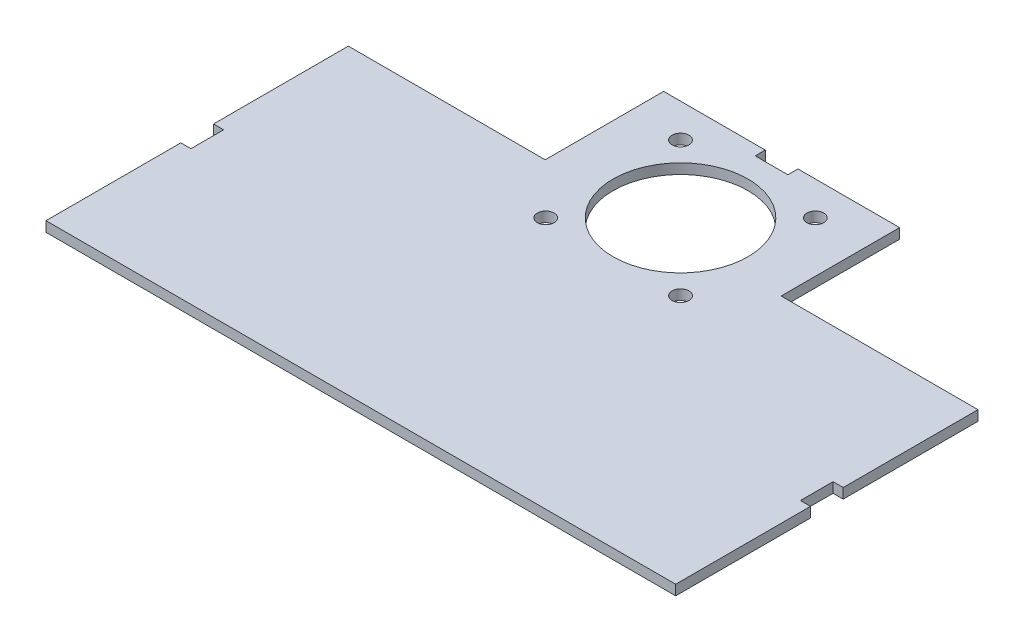
ISO-10303-21;
HEADER;
FILE_DESCRIPTION(('STEP AP214'),'2;1');
FILE_NAME('part.step','',(''),(''),'','','');
FILE_SCHEMA(('AUTOMOTIVE_DESIGN { 1 0 10303 214 1 1 1 1 }'));
ENDSEC;
DATA;
#1=APPLICATION_CONTEXT('core data for automotive mechanical design processes');
#2=APPLICATION_PROTOCOL_DEFINITION('international standard','automotive_design',2000,#1);
#3=PRODUCT_CONTEXT('',#1,'mechanical');
#4=PRODUCT('Part','Part','',(#3));
#5=PRODUCT_RELATED_PRODUCT_CATEGORY('part','',(#4));
#6=PRODUCT_DEFINITION_FORMATION('','',#4);
#7=PRODUCT_DEFINITION_CONTEXT('part definition',#1,'design');
#8=PRODUCT_DEFINITION('design','',#6,#7);
#9=PRODUCT_DEFINITION_SHAPE('','',#8);
#10=(LENGTH_UNIT() NAMED_UNIT(*) SI_UNIT(.MILLI.,.METRE.));
#11=(NAMED_UNIT(*) PLANE_ANGLE_UNIT() SI_UNIT($,.RADIAN.));
#12=(NAMED_UNIT(*) SI_UNIT($,.STERADIAN.) SOLID_ANGLE_UNIT());
#13=UNCERTAINTY_MEASURE_WITH_UNIT(LENGTH_MEASURE(1.E-05),#10,'distance_accuracy_value','');
#14=(GEOMETRIC_REPRESENTATION_CONTEXT(3) GLOBAL_UNCERTAINTY_ASSIGNED_CONTEXT((#13)) GLOBAL_UNIT_ASSIGNED_CONTEXT((#10,
#11,#12)) REPRESENTATION_CONTEXT('',''));
#15=CARTESIAN_POINT('',(0.,0.,0.));
#16=DIRECTION('',(0.,0.,1.));
#17=DIRECTION('',(1.,0.,0.));
#18=AXIS2_PLACEMENT_3D('',#15,#16,#17);
#19=CARTESIAN_POINT('',(-148.288384343825,3.,101.609139144492));
#20=DIRECTION('',(0.,0.,-1.));
#21=DIRECTION('',(-1.,0.,0.));
#22=AXIS2_PLACEMENT_3D('',#19,#20,#21);
#23=PLANE('',#22);
#24=DIRECTION('',(1.,0.,0.));
#25=VECTOR('',#24,1.);
#26=CARTESIAN_POINT('',(-148.288384343825,0.,101.609139144492));
#27=LINE('',#26,#25);
#28=CARTESIAN_POINT('',(-151.288384343825,0.,101.609139144492));
#29=VERTEX_POINT('',#28);
#30=CARTESIAN_POINT('',(-148.288384343825,0.,101.609139144492));
#31=VERTEX_POINT('',#30);
#32=EDGE_CURVE('E206',#29,#31,#27,.T.);
#33=ORIENTED_EDGE('',*,*,#32,.T.);
#34=DIRECTION('',(0.,-1.,0.));
#35=VECTOR('',#34,1.);
#36=CARTESIAN_POINT('',(-148.288384343825,3.,101.609139144492));
#37=LINE('',#36,#35);
#38=CARTESIAN_POINT('',(-148.288384343825,3.,101.609139144492));
#39=VERTEX_POINT('',#38);
#40=EDGE_CURVE('E11',#39,#31,#37,.T.);
#41=ORIENTED_EDGE('',*,*,#40,.F.);
#42=DIRECTION('',(1.,0.,0.));
#43=VECTOR('',#42,1.);
#44=CARTESIAN_POINT('',(-148.288384343825,3.,101.609139144492));
#45=LINE('',#44,#43);
#46=CARTESIAN_POINT('',(-151.288384343825,3.,101.609139144492));
#47=VERTEX_POINT('',#46);
#48=EDGE_CURVE('E244',#47,#39,#45,.T.);
#49=ORIENTED_EDGE('',*,*,#48,.F.);
#50=DIRECTION('',(0.,-1.,0.));
#51=VECTOR('',#50,1.);
#52=CARTESIAN_POINT('',(-151.288384343825,3.,101.609139144492));
#53=LINE('',#52,#51);
#54=EDGE_CURVE('E202',#47,#29,#53,.T.);
#55=ORIENTED_EDGE('',*,*,#54,.T.);
#56=EDGE_LOOP('',(#33,#41,#49,#55));
#57=FACE_BOUND('',#56,.T.);
#58=ADVANCED_FACE('F36',(#57),#23,.F.);
#59=CARTESIAN_POINT('',(-148.288384343825,3.,111.309139144492));
#60=DIRECTION('',(1.,0.,0.));
#61=DIRECTION('',(0.,0.,-1.));
#62=AXIS2_PLACEMENT_3D('',#59,#60,#61);
#63=PLANE('',#62);
#64=DIRECTION('',(0.,0.,1.));
#65=VECTOR('',#64,1.);
#66=CARTESIAN_POINT('',(-148.288384343825,0.,111.309139144492));
#67=LINE('',#66,#65);
#68=CARTESIAN_POINT('',(-148.288384343825,0.,111.309139144492));
#69=VERTEX_POINT('',#68);
#70=EDGE_CURVE('E209',#31,#69,#67,.T.);
#71=ORIENTED_EDGE('',*,*,#70,.T.);
#72=DIRECTION('',(0.,-1.,0.));
#73=VECTOR('',#72,1.);
#74=CARTESIAN_POINT('',(-148.288384343825,3.,111.309139144492));
#75=LINE('',#74,#73);
#76=CARTESIAN_POINT('',(-148.288384343825,3.,111.309139144492));
#77=VERTEX_POINT('',#76);
#78=EDGE_CURVE('E45',#77,#69,#75,.T.);
#79=ORIENTED_EDGE('',*,*,#78,.F.);
#80=DIRECTION('',(0.,0.,1.));
#81=VECTOR('',#80,1.);
#82=CARTESIAN_POINT('',(-148.288384343825,3.,111.309139144492));
#83=LINE('',#82,#81);
#84=EDGE_CURVE('E133',#39,#77,#83,.T.);
#85=ORIENTED_EDGE('',*,*,#84,.F.);
#86=ORIENTED_EDGE('',*,*,#40,.T.);
#87=EDGE_LOOP('',(#71,#79,#85,#86));
#88=FACE_BOUND('',#87,.T.);
#89=ADVANCED_FACE('F340',(#88),#63,.F.);
#90=CARTESIAN_POINT('',(-148.288384343825,3.,111.309139144492));
#91=DIRECTION('',(0.,0.,1.));
#92=DIRECTION('',(1.,0.,0.));
#93=AXIS2_PLACEMENT_3D('',#90,#91,#92);
#94=PLANE('',#93);
#95=DIRECTION('',(-1.,0.,0.));
#96=VECTOR('',#95,1.);
#97=CARTESIAN_POINT('',(-148.288384343825,0.,111.309139144492));
#98=LINE('',#97,#96);
#99=CARTESIAN_POINT('',(-151.288384343825,0.,111.309139144492));
#100=VERTEX_POINT('',#99);
#101=EDGE_CURVE('E211',#69,#100,#98,.T.);
#102=ORIENTED_EDGE('',*,*,#101,.T.);
#103=DIRECTION('',(0.,-1.,0.));
#104=VECTOR('',#103,1.);
#105=CARTESIAN_POINT('',(-151.288384343825,3.,111.309139144492));
#106=LINE('',#105,#104);
#107=CARTESIAN_POINT('',(-151.288384343825,3.,111.309139144492));
#108=VERTEX_POINT('',#107);
#109=EDGE_CURVE('E287',#108,#100,#106,.T.);
#110=ORIENTED_EDGE('',*,*,#109,.F.);
#111=DIRECTION('',(-1.,0.,0.));
#112=VECTOR('',#111,1.);
#113=CARTESIAN_POINT('',(-148.288384343825,3.,111.309139144492));
#114=LINE('',#113,#112);
#115=EDGE_CURVE('E495',#77,#108,#114,.T.);
#116=ORIENTED_EDGE('',*,*,#115,.F.);
#117=ORIENTED_EDGE('',*,*,#78,.T.);
#118=EDGE_LOOP('',(#102,#110,#116,#117));
#119=FACE_BOUND('',#118,.T.);
#120=ADVANCED_FACE('F344',(#119),#94,.F.);
#121=CARTESIAN_POINT('',(-151.288384343825,3.,111.309139144492));
#122=DIRECTION('',(1.,0.,0.));
#123=DIRECTION('',(0.,0.,-1.));
#124=AXIS2_PLACEMENT_3D('',#121,#122,#123);
#125=PLANE('',#124);
#126=DIRECTION('',(0.,0.,1.));
#127=VECTOR('',#126,1.);
#128=CARTESIAN_POINT('',(-151.288384343825,0.,111.309139144492));
#129=LINE('',#128,#127);
#130=CARTESIAN_POINT('',(-151.288384343825,0.,151.309139144492));
#131=VERTEX_POINT('',#130);
#132=EDGE_CURVE('E213',#100,#131,#129,.T.);
#133=ORIENTED_EDGE('',*,*,#132,.T.);
#134=DIRECTION('',(0.,-1.,0.));
#135=VECTOR('',#134,1.);
#136=CARTESIAN_POINT('',(-151.288384343825,3.,151.309139144492));
#137=LINE('',#136,#135);
#138=CARTESIAN_POINT('',(-151.288384343825,3.,151.309139144492));
#139=VERTEX_POINT('',#138);
#140=EDGE_CURVE('E284',#139,#131,#137,.T.);
#141=ORIENTED_EDGE('',*,*,#140,.F.);
#142=DIRECTION('',(0.,0.,1.));
#143=VECTOR('',#142,1.);
#144=CARTESIAN_POINT('',(-151.288384343825,3.,111.309139144492));
#145=LINE('',#144,#143);
#146=EDGE_CURVE('E497',#108,#139,#145,.T.);
#147=ORIENTED_EDGE('',*,*,#146,.F.);
#148=ORIENTED_EDGE('',*,*,#109,.T.);
#149=EDGE_LOOP('',(#133,#141,#147,#148));
#150=FACE_BOUND('',#149,.T.);
#151=ADVANCED_FACE('F348',(#150),#125,.F.);
#152=CARTESIAN_POINT('',(-151.288384343825,3.,151.309139144492));
#153=DIRECTION('',(0.,0.,-1.));
#154=DIRECTION('',(-1.,0.,0.));
#155=AXIS2_PLACEMENT_3D('',#152,#153,#154);
#156=PLANE('',#155);
#157=DIRECTION('',(1.,0.,0.));
#158=VECTOR('',#157,1.);
#159=CARTESIAN_POINT('',(-151.288384343825,0.,151.309139144492));
#160=LINE('',#159,#158);
#161=CARTESIAN_POINT('',(35.5316156561952,0.,151.309139144492));
#162=VERTEX_POINT('',#161);
#163=EDGE_CURVE('E215',#131,#162,#160,.T.);
#164=ORIENTED_EDGE('',*,*,#163,.T.);
#165=DIRECTION('',(0.,-1.,0.));
#166=VECTOR('',#165,1.);
#167=CARTESIAN_POINT('',(35.5316156561952,3.,151.309139144492));
#168=LINE('',#167,#166);
#169=CARTESIAN_POINT('',(35.5316156561952,3.,151.309139144492));
#170=VERTEX_POINT('',#169);
#171=EDGE_CURVE('E281',#170,#162,#168,.T.);
#172=ORIENTED_EDGE('',*,*,#171,.F.);
#173=DIRECTION('',(1.,0.,0.));
#174=VECTOR('',#173,1.);
#175=CARTESIAN_POINT('',(-151.288384343825,3.,151.309139144492));
#176=LINE('',#175,#174);
#177=EDGE_CURVE('E499',#139,#170,#176,.T.);
#178=ORIENTED_EDGE('',*,*,#177,.F.);
#179=ORIENTED_EDGE('',*,*,#140,.T.);
#180=EDGE_LOOP('',(#164,#172,#178,#179));
#181=FACE_BOUND('',#180,.T.);
#182=ADVANCED_FACE('F354',(#181),#156,.F.);
#183=CARTESIAN_POINT('',(35.5316156561952,3.,151.309139144492));
#184=DIRECTION('',(-1.,0.,0.));
#185=DIRECTION('',(0.,0.,1.));
#186=AXIS2_PLACEMENT_3D('',#183,#184,#185);
#187=PLANE('',#186);
#188=DIRECTION('',(0.,0.,-1.));
#189=VECTOR('',#188,1.);
#190=CARTESIAN_POINT('',(35.5316156561952,0.,151.309139144492));
#191=LINE('',#190,#189);
#192=CARTESIAN_POINT('',(35.5316156561952,0.,111.309139144492));
#193=VERTEX_POINT('',#192);
#194=EDGE_CURVE('E217',#162,#193,#191,.T.);
#195=ORIENTED_EDGE('',*,*,#194,.T.);
#196=DIRECTION('',(0.,-1.,0.));
#197=VECTOR('',#196,1.);
#198=CARTESIAN_POINT('',(35.5316156561952,3.,111.309139144492));
#199=LINE('',#198,#197);
#200=CARTESIAN_POINT('',(35.5316156561952,3.,111.309139144492));
#201=VERTEX_POINT('',#200);
#202=EDGE_CURVE('E278',#201,#193,#199,.T.);
#203=ORIENTED_EDGE('',*,*,#202,.F.);
#204=DIRECTION('',(0.,0.,-1.));
#205=VECTOR('',#204,1.);
#206=CARTESIAN_POINT('',(35.5316156561952,3.,151.309139144492));
#207=LINE('',#206,#205);
#208=EDGE_CURVE('E501',#170,#201,#207,.T.);
#209=ORIENTED_EDGE('',*,*,#208,.F.);
#210=ORIENTED_EDGE('',*,*,#171,.T.);
#211=EDGE_LOOP('',(#195,#203,#209,#210));
#212=FACE_BOUND('',#211,.T.);
#213=ADVANCED_FACE('F358',(#212),#187,.F.);
#214=CARTESIAN_POINT('',(35.5316156561952,3.,111.309139144492));
#215=DIRECTION('',(0.,0.,1.));
#216=DIRECTION('',(1.,0.,0.));
#217=AXIS2_PLACEMENT_3D('',#214,#215,#216);
#218=PLANE('',#217);
#219=DIRECTION('',(-1.,0.,0.));
#220=VECTOR('',#219,1.);
#221=CARTESIAN_POINT('',(35.5316156561952,0.,111.309139144492));
#222=LINE('',#221,#220);
#223=CARTESIAN_POINT('',(32.5316156561952,0.,111.309139144492));
#224=VERTEX_POINT('',#223);
#225=EDGE_CURVE('E219',#193,#224,#222,.T.);
#226=ORIENTED_EDGE('',*,*,#225,.T.);
#227=DIRECTION('',(0.,-1.,0.));
#228=VECTOR('',#227,1.);
#229=CARTESIAN_POINT('',(32.5316156561952,3.,111.309139144492));
#230=LINE('',#229,#228);
#231=CARTESIAN_POINT('',(32.5316156561952,3.,111.309139144492));
#232=VERTEX_POINT('',#231);
#233=EDGE_CURVE('E275',#232,#224,#230,.T.);
#234=ORIENTED_EDGE('',*,*,#233,.F.);
#235=DIRECTION('',(-1.,0.,0.));
#236=VECTOR('',#235,1.);
#237=CARTESIAN_POINT('',(35.5316156561952,3.,111.309139144492));
#238=LINE('',#237,#236);
#239=EDGE_CURVE('E503',#201,#232,#238,.T.);
#240=ORIENTED_EDGE('',*,*,#239,.F.);
#241=ORIENTED_EDGE('',*,*,#202,.T.);
#242=EDGE_LOOP('',(#226,#234,#240,#241));
#243=FACE_BOUND('',#242,.T.);
#244=ADVANCED_FACE('F362',(#243),#218,.F.);
#245=CARTESIAN_POINT('',(32.5316156561953,3.,101.609139144492));
#246=DIRECTION('',(-1.,0.,0.));
#247=DIRECTION('',(0.,0.,1.));
#248=AXIS2_PLACEMENT_3D('',#245,#246,#247);
#249=PLANE('',#248);
#250=DIRECTION('',(0.,0.,-1.));
#251=VECTOR('',#250,1.);
#252=CARTESIAN_POINT('',(32.5316156561953,0.,101.609139144492));
#253=LINE('',#252,#251);
#254=CARTESIAN_POINT('',(32.5316156561953,0.,101.609139144492));
#255=VERTEX_POINT('',#254);
#256=EDGE_CURVE('E221',#224,#255,#253,.T.);
#257=ORIENTED_EDGE('',*,*,#256,.T.);
#258=DIRECTION('',(0.,-1.,0.));
#259=VECTOR('',#258,1.);
#260=CARTESIAN_POINT('',(32.5316156561953,3.,101.609139144492));
#261=LINE('',#260,#259);
#262=CARTESIAN_POINT('',(32.5316156561953,3.,101.609139144492));
#263=VERTEX_POINT('',#262);
#264=EDGE_CURVE('E272',#263,#255,#261,.T.);
#265=ORIENTED_EDGE('',*,*,#264,.F.);
#266=DIRECTION('',(0.,0.,-1.));
#267=VECTOR('',#266,1.);
#268=CARTESIAN_POINT('',(32.5316156561953,3.,101.609139144492));
#269=LINE('',#268,#267);
#270=EDGE_CURVE('E505',#232,#263,#269,.T.);
#271=ORIENTED_EDGE('',*,*,#270,.F.);
#272=ORIENTED_EDGE('',*,*,#233,.T.);
#273=EDGE_LOOP('',(#257,#265,#271,#272));
#274=FACE_BOUND('',#273,.T.);
#275=ADVANCED_FACE('F366',(#274),#249,.F.);
#276=CARTESIAN_POINT('',(35.5316156561953,3.,101.609139144492));
#277=DIRECTION('',(0.,0.,-1.));
#278=DIRECTION('',(-1.,0.,0.));
#279=AXIS2_PLACEMENT_3D('',#276,#277,#278);
#280=PLANE('',#279);
#281=DIRECTION('',(1.,0.,0.));
#282=VECTOR('',#281,1.);
#283=CARTESIAN_POINT('',(35.5316156561953,0.,101.609139144492));
#284=LINE('',#283,#282);
#285=CARTESIAN_POINT('',(35.5316156561953,0.,101.609139144492));
#286=VERTEX_POINT('',#285);
#287=EDGE_CURVE('E223',#255,#286,#284,.T.);
#288=ORIENTED_EDGE('',*,*,#287,.T.);
#289=DIRECTION('',(0.,-1.,0.));
#290=VECTOR('',#289,1.);
#291=CARTESIAN_POINT('',(35.5316156561953,3.,101.609139144492));
#292=LINE('',#291,#290);
#293=CARTESIAN_POINT('',(35.5316156561953,3.,101.609139144492));
#294=VERTEX_POINT('',#293);
#295=EDGE_CURVE('E269',#294,#286,#292,.T.);
#296=ORIENTED_EDGE('',*,*,#295,.F.);
#297=DIRECTION('',(1.,0.,0.));
#298=VECTOR('',#297,1.);
#299=CARTESIAN_POINT('',(35.5316156561953,3.,101.609139144492));
#300=LINE('',#299,#298);
#301=EDGE_CURVE('E507',#263,#294,#300,.T.);
#302=ORIENTED_EDGE('',*,*,#301,.F.);
#303=ORIENTED_EDGE('',*,*,#264,.T.);
#304=EDGE_LOOP('',(#288,#296,#302,#303));
#305=FACE_BOUND('',#304,.T.);
#306=ADVANCED_FACE('F370',(#305),#280,.F.);
#307=CARTESIAN_POINT('',(35.5316156561953,3.,61.609139144492));
#308=DIRECTION('',(-1.,0.,0.));
#309=DIRECTION('',(0.,0.,1.));
#310=AXIS2_PLACEMENT_3D('',#307,#308,#309);
#311=PLANE('',#310);
#312=DIRECTION('',(0.,0.,-1.));
#313=VECTOR('',#312,1.);
#314=CARTESIAN_POINT('',(35.5316156561953,0.,61.609139144492));
#315=LINE('',#314,#313);
#316=CARTESIAN_POINT('',(35.5316156561953,0.,61.609139144492));
#317=VERTEX_POINT('',#316);
#318=EDGE_CURVE('E225',#286,#317,#315,.T.);
#319=ORIENTED_EDGE('',*,*,#318,.T.);
#320=DIRECTION('',(0.,-1.,0.));
#321=VECTOR('',#320,1.);
#322=CARTESIAN_POINT('',(35.5316156561953,3.,61.609139144492));
#323=LINE('',#322,#321);
#324=CARTESIAN_POINT('',(35.5316156561953,3.,61.609139144492));
#325=VERTEX_POINT('',#324);
#326=EDGE_CURVE('E266',#325,#317,#323,.T.);
#327=ORIENTED_EDGE('',*,*,#326,.F.);
#328=DIRECTION('',(0.,0.,-1.));
#329=VECTOR('',#328,1.);
#330=CARTESIAN_POINT('',(35.5316156561953,3.,61.609139144492));
#331=LINE('',#330,#329);
#332=EDGE_CURVE('E509',#294,#325,#331,.T.);
#333=ORIENTED_EDGE('',*,*,#332,.F.);
#334=ORIENTED_EDGE('',*,*,#295,.T.);
#335=EDGE_LOOP('',(#319,#327,#333,#334));
#336=FACE_BOUND('',#335,.T.);
#337=ADVANCED_FACE('F374',(#336),#311,.F.);
#338=CARTESIAN_POINT('',(-22.878384343815,3.,61.609139144492));
#339=DIRECTION('',(0.,0.,1.));
#340=DIRECTION('',(1.,0.,0.));
#341=AXIS2_PLACEMENT_3D('',#338,#339,#340);
#342=PLANE('',#341);
#343=DIRECTION('',(-1.,0.,0.));
#344=VECTOR('',#343,1.);
#345=CARTESIAN_POINT('',(-22.878384343815,0.,61.609139144492));
#346=LINE('',#345,#344);
#347=CARTESIAN_POINT('',(-22.878384343815,0.,61.609139144492));
#348=VERTEX_POINT('',#347);
#349=EDGE_CURVE('E227',#317,#348,#346,.T.);
#350=ORIENTED_EDGE('',*,*,#349,.T.);
#351=DIRECTION('',(0.,-1.,0.));
#352=VECTOR('',#351,1.);
#353=CARTESIAN_POINT('',(-22.878384343815,3.,61.609139144492));
#354=LINE('',#353,#352);
#355=CARTESIAN_POINT('',(-22.878384343815,3.,61.609139144492));
#356=VERTEX_POINT('',#355);
#357=EDGE_CURVE('E263',#356,#348,#354,.T.);
#358=ORIENTED_EDGE('',*,*,#357,.F.);
#359=DIRECTION('',(-1.,0.,0.));
#360=VECTOR('',#359,1.);
#361=CARTESIAN_POINT('',(-22.878384343815,3.,61.609139144492));
#362=LINE('',#361,#360);
#363=EDGE_CURVE('E511',#325,#356,#362,.T.);
#364=ORIENTED_EDGE('',*,*,#363,.F.);
#365=ORIENTED_EDGE('',*,*,#326,.T.);
#366=EDGE_LOOP('',(#350,#358,#364,#365));
#367=FACE_BOUND('',#366,.T.);
#368=ADVANCED_FACE('F378',(#367),#342,.F.);
#369=CARTESIAN_POINT('',(-22.878384343815,3.,26.459139144492));
#370=DIRECTION('',(-1.,0.,0.));
#371=DIRECTION('',(0.,0.,1.));
#372=AXIS2_PLACEMENT_3D('',#369,#370,#371);
#373=PLANE('',#372);
#374=DIRECTION('',(0.,0.,-1.));
#375=VECTOR('',#374,1.);
#376=CARTESIAN_POINT('',(-22.878384343815,0.,26.459139144492));
#377=LINE('',#376,#375);
#378=CARTESIAN_POINT('',(-22.878384343815,0.,26.459139144492));
#379=VERTEX_POINT('',#378);
#380=EDGE_CURVE('E229',#348,#379,#377,.T.);
#381=ORIENTED_EDGE('',*,*,#380,.T.);
#382=DIRECTION('',(0.,-1.,0.));
#383=VECTOR('',#382,1.);
#384=CARTESIAN_POINT('',(-22.878384343815,3.,26.459139144492));
#385=LINE('',#384,#383);
#386=CARTESIAN_POINT('',(-22.878384343815,3.,26.459139144492));
#387=VERTEX_POINT('',#386);
#388=EDGE_CURVE('E260',#387,#379,#385,.T.);
#389=ORIENTED_EDGE('',*,*,#388,.F.);
#390=DIRECTION('',(0.,0.,-1.));
#391=VECTOR('',#390,1.);
#392=CARTESIAN_POINT('',(-22.878384343815,3.,26.459139144492));
#393=LINE('',#392,#391);
#394=EDGE_CURVE('E513',#356,#387,#393,.T.);
#395=ORIENTED_EDGE('',*,*,#394,.F.);
#396=ORIENTED_EDGE('',*,*,#357,.T.);
#397=EDGE_LOOP('',(#381,#389,#395,#396));
#398=FACE_BOUND('',#397,.T.);
#399=ADVANCED_FACE('F382',(#398),#373,.F.);
#400=CARTESIAN_POINT('',(-22.878384343815,3.,26.459139144492));
#401=DIRECTION('',(0.,0.,1.));
#402=DIRECTION('',(1.,0.,0.));
#403=AXIS2_PLACEMENT_3D('',#400,#401,#402);
#404=PLANE('',#403);
#405=DIRECTION('',(-1.,0.,0.));
#406=VECTOR('',#405,1.);
#407=CARTESIAN_POINT('',(-22.878384343815,0.,26.459139144492));
#408=LINE('',#407,#406);
#409=CARTESIAN_POINT('',(-53.028384343815,0.,26.4591391444919));
#410=VERTEX_POINT('',#409);
#411=EDGE_CURVE('E231',#379,#410,#408,.T.);
#412=ORIENTED_EDGE('',*,*,#411,.T.);
#413=DIRECTION('',(0.,-1.,0.));
#414=VECTOR('',#413,1.);
#415=CARTESIAN_POINT('',(-53.028384343815,3.,26.4591391444919));
#416=LINE('',#415,#414);
#417=CARTESIAN_POINT('',(-53.028384343815,3.,26.4591391444919));
#418=VERTEX_POINT('',#417);
#419=EDGE_CURVE('E257',#418,#410,#416,.T.);
#420=ORIENTED_EDGE('',*,*,#419,.F.);
#421=DIRECTION('',(-1.,0.,0.));
#422=VECTOR('',#421,1.);
#423=CARTESIAN_POINT('',(-22.878384343815,3.,26.459139144492));
#424=LINE('',#423,#422);
#425=EDGE_CURVE('E515',#387,#418,#424,.T.);
#426=ORIENTED_EDGE('',*,*,#425,.F.);
#427=ORIENTED_EDGE('',*,*,#388,.T.);
#428=EDGE_LOOP('',(#412,#420,#426,#427));
#429=FACE_BOUND('',#428,.T.);
#430=ADVANCED_FACE('F386',(#429),#404,.F.);
#431=CARTESIAN_POINT('',(-53.028384343815,3.,29.459139144492));
#432=DIRECTION('',(1.,0.,0.));
#433=DIRECTION('',(0.,0.,-1.));
#434=AXIS2_PLACEMENT_3D('',#431,#432,#433);
#435=PLANE('',#434);
#436=DIRECTION('',(0.,0.,1.));
#437=VECTOR('',#436,1.);
#438=CARTESIAN_POINT('',(-53.028384343815,0.,29.459139144492));
#439=LINE('',#438,#437);
#440=CARTESIAN_POINT('',(-53.028384343815,0.,29.459139144492));
#441=VERTEX_POINT('',#440);
#442=EDGE_CURVE('E233',#410,#441,#439,.T.);
#443=ORIENTED_EDGE('',*,*,#442,.T.);
#444=DIRECTION('',(0.,-1.,0.));
#445=VECTOR('',#444,1.);
#446=CARTESIAN_POINT('',(-53.028384343815,3.,29.459139144492));
#447=LINE('',#446,#445);
#448=CARTESIAN_POINT('',(-53.028384343815,3.,29.459139144492));
#449=VERTEX_POINT('',#448);
#450=EDGE_CURVE('E254',#449,#441,#447,.T.);
#451=ORIENTED_EDGE('',*,*,#450,.F.);
#452=DIRECTION('',(0.,0.,1.));
#453=VECTOR('',#452,1.);
#454=CARTESIAN_POINT('',(-53.028384343815,3.,29.459139144492));
#455=LINE('',#454,#453);
#456=EDGE_CURVE('E517',#418,#449,#455,.T.);
#457=ORIENTED_EDGE('',*,*,#456,.F.);
#458=ORIENTED_EDGE('',*,*,#419,.T.);
#459=EDGE_LOOP('',(#443,#451,#457,#458));
#460=FACE_BOUND('',#459,.T.);
#461=ADVANCED_FACE('F390',(#460),#435,.F.);
#462=CARTESIAN_POINT('',(-62.728384343815,3.,29.459139144492));
#463=DIRECTION('',(0.,0.,1.));
#464=DIRECTION('',(1.,0.,0.));
#465=AXIS2_PLACEMENT_3D('',#462,#463,#464);
#466=PLANE('',#465);
#467=DIRECTION('',(-1.,0.,0.));
#468=VECTOR('',#467,1.);
#469=CARTESIAN_POINT('',(-62.728384343815,0.,29.459139144492));
#470=LINE('',#469,#468);
#471=CARTESIAN_POINT('',(-62.728384343815,0.,29.459139144492));
#472=VERTEX_POINT('',#471);
#473=EDGE_CURVE('E235',#441,#472,#470,.T.);
#474=ORIENTED_EDGE('',*,*,#473,.T.);
#475=DIRECTION('',(0.,-1.,0.));
#476=VECTOR('',#475,1.);
#477=CARTESIAN_POINT('',(-62.728384343815,3.,29.459139144492));
#478=LINE('',#477,#476);
#479=CARTESIAN_POINT('',(-62.728384343815,3.,29.459139144492));
#480=VERTEX_POINT('',#479);
#481=EDGE_CURVE('E251',#480,#472,#478,.T.);
#482=ORIENTED_EDGE('',*,*,#481,.F.);
#483=DIRECTION('',(-1.,0.,0.));
#484=VECTOR('',#483,1.);
#485=CARTESIAN_POINT('',(-62.728384343815,3.,29.459139144492));
#486=LINE('',#485,#484);
#487=EDGE_CURVE('E519',#449,#480,#486,.T.);
#488=ORIENTED_EDGE('',*,*,#487,.F.);
#489=ORIENTED_EDGE('',*,*,#450,.T.);
#490=EDGE_LOOP('',(#474,#482,#488,#489));
#491=FACE_BOUND('',#490,.T.);
#492=ADVANCED_FACE('F394',(#491),#466,.F.);
#493=CARTESIAN_POINT('',(-62.728384343815,3.,29.459139144492));
#494=DIRECTION('',(-1.,0.,0.));
#495=DIRECTION('',(0.,0.,1.));
#496=AXIS2_PLACEMENT_3D('',#493,#494,#495);
#497=PLANE('',#496);
#498=DIRECTION('',(0.,0.,-1.));
#499=VECTOR('',#498,1.);
#500=CARTESIAN_POINT('',(-62.728384343815,0.,29.459139144492));
#501=LINE('',#500,#499);
#502=CARTESIAN_POINT('',(-62.728384343815,0.,26.459139144492));
#503=VERTEX_POINT('',#502);
#504=EDGE_CURVE('E237',#472,#503,#501,.T.);
#505=ORIENTED_EDGE('',*,*,#504,.T.);
#506=DIRECTION('',(0.,-1.,0.));
#507=VECTOR('',#506,1.);
#508=CARTESIAN_POINT('',(-62.728384343815,3.,26.459139144492));
#509=LINE('',#508,#507);
#510=CARTESIAN_POINT('',(-62.728384343815,3.,26.459139144492));
#511=VERTEX_POINT('',#510);
#512=EDGE_CURVE('E248',#511,#503,#509,.T.);
#513=ORIENTED_EDGE('',*,*,#512,.F.);
#514=DIRECTION('',(0.,0.,-1.));
#515=VECTOR('',#514,1.);
#516=CARTESIAN_POINT('',(-62.728384343815,3.,29.459139144492));
#517=LINE('',#516,#515);
#518=EDGE_CURVE('E521',#480,#511,#517,.T.);
#519=ORIENTED_EDGE('',*,*,#518,.F.);
#520=ORIENTED_EDGE('',*,*,#481,.T.);
#521=EDGE_LOOP('',(#505,#513,#519,#520));
#522=FACE_BOUND('',#521,.T.);
#523=ADVANCED_FACE('F398',(#522),#497,.F.);
#524=CARTESIAN_POINT('',(-62.728384343815,3.,26.459139144492));
#525=DIRECTION('',(0.,0.,1.));
#526=DIRECTION('',(1.,0.,0.));
#527=AXIS2_PLACEMENT_3D('',#524,#525,#526);
#528=PLANE('',#527);
#529=DIRECTION('',(-1.,0.,0.));
#530=VECTOR('',#529,1.);
#531=CARTESIAN_POINT('',(-62.728384343815,0.,26.459139144492));
#532=LINE('',#531,#530);
#533=CARTESIAN_POINT('',(-92.878384343815,0.,26.459139144492));
#534=VERTEX_POINT('',#533);
#535=EDGE_CURVE('E239',#503,#534,#532,.T.);
#536=ORIENTED_EDGE('',*,*,#535,.T.);
#537=DIRECTION('',(0.,-1.,0.));
#538=VECTOR('',#537,1.);
#539=CARTESIAN_POINT('',(-92.878384343815,3.,26.459139144492));
#540=LINE('',#539,#538);
#541=CARTESIAN_POINT('',(-92.878384343815,3.,26.459139144492));
#542=VERTEX_POINT('',#541);
#543=EDGE_CURVE('E197',#542,#534,#540,.T.);
#544=ORIENTED_EDGE('',*,*,#543,.F.);
#545=DIRECTION('',(-1.,0.,0.));
#546=VECTOR('',#545,1.);
#547=CARTESIAN_POINT('',(-62.728384343815,3.,26.459139144492));
#548=LINE('',#547,#546);
#549=EDGE_CURVE('E188',#511,#542,#548,.T.);
#550=ORIENTED_EDGE('',*,*,#549,.F.);
#551=ORIENTED_EDGE('',*,*,#512,.T.);
#552=EDGE_LOOP('',(#536,#544,#550,#551));
#553=FACE_BOUND('',#552,.T.);
#554=ADVANCED_FACE('F402',(#553),#528,.F.);
#555=CARTESIAN_POINT('',(-92.878384343815,3.,26.459139144492));
#556=DIRECTION('',(1.,0.,0.));
#557=DIRECTION('',(0.,0.,-1.));
#558=AXIS2_PLACEMENT_3D('',#555,#556,#557);
#559=PLANE('',#558);
#560=DIRECTION('',(0.,0.,1.));
#561=VECTOR('',#560,1.);
#562=CARTESIAN_POINT('',(-92.878384343815,0.,26.459139144492));
#563=LINE('',#562,#561);
#564=CARTESIAN_POINT('',(-92.878384343815,0.,61.609139144492));
#565=VERTEX_POINT('',#564);
#566=EDGE_CURVE('E196',#534,#565,#563,.T.);
#567=ORIENTED_EDGE('',*,*,#566,.T.);
#568=DIRECTION('',(0.,-1.,0.));
#569=VECTOR('',#568,1.);
#570=CARTESIAN_POINT('',(-92.878384343815,3.,61.609139144492));
#571=LINE('',#570,#569);
#572=CARTESIAN_POINT('',(-92.878384343815,3.,61.609139144492));
#573=VERTEX_POINT('',#572);
#574=EDGE_CURVE('E193',#573,#565,#571,.T.);
#575=ORIENTED_EDGE('',*,*,#574,.F.);
#576=DIRECTION('',(0.,0.,1.));
#577=VECTOR('',#576,1.);
#578=CARTESIAN_POINT('',(-92.878384343815,3.,26.459139144492));
#579=LINE('',#578,#577);
#580=EDGE_CURVE('E182',#542,#573,#579,.T.);
#581=ORIENTED_EDGE('',*,*,#580,.F.);
#582=ORIENTED_EDGE('',*,*,#543,.T.);
#583=EDGE_LOOP('',(#567,#575,#581,#582));
#584=FACE_BOUND('',#583,.T.);
#585=ADVANCED_FACE('F194',(#584),#559,.F.);
#586=CARTESIAN_POINT('',(-151.288384343825,3.,61.609139144492));
#587=DIRECTION('',(0.,0.,1.));
#588=DIRECTION('',(1.,0.,0.));
#589=AXIS2_PLACEMENT_3D('',#586,#587,#588);
#590=PLANE('',#589);
#591=DIRECTION('',(-1.,0.,0.));
#592=VECTOR('',#591,1.);
#593=CARTESIAN_POINT('',(-151.288384343825,0.,61.609139144492));
#594=LINE('',#593,#592);
#595=CARTESIAN_POINT('',(-151.288384343825,0.,61.609139144492));
#596=VERTEX_POINT('',#595);
#597=EDGE_CURVE('E119',#565,#596,#594,.T.);
#598=ORIENTED_EDGE('',*,*,#597,.T.);
#599=DIRECTION('',(0.,-1.,0.));
#600=VECTOR('',#599,1.);
#601=CARTESIAN_POINT('',(-151.288384343825,3.,61.609139144492));
#602=LINE('',#601,#600);
#603=CARTESIAN_POINT('',(-151.288384343825,3.,61.609139144492));
#604=VERTEX_POINT('',#603);
#605=EDGE_CURVE('E198',#604,#596,#602,.T.);
#606=ORIENTED_EDGE('',*,*,#605,.F.);
#607=DIRECTION('',(-1.,0.,0.));
#608=VECTOR('',#607,1.);
#609=CARTESIAN_POINT('',(-151.288384343825,3.,61.609139144492));
#610=LINE('',#609,#608);
#611=EDGE_CURVE('E186',#573,#604,#610,.T.);
#612=ORIENTED_EDGE('',*,*,#611,.F.);
#613=ORIENTED_EDGE('',*,*,#574,.T.);
#614=EDGE_LOOP('',(#598,#606,#612,#613));
#615=FACE_BOUND('',#614,.T.);
#616=ADVANCED_FACE('F200',(#615),#590,.F.);
#617=CARTESIAN_POINT('',(-151.288384343825,3.,101.609139144492));
#618=DIRECTION('',(1.,0.,0.));
#619=DIRECTION('',(0.,0.,-1.));
#620=AXIS2_PLACEMENT_3D('',#617,#618,#619);
#621=PLANE('',#620);
#622=DIRECTION('',(0.,0.,1.));
#623=VECTOR('',#622,1.);
#624=CARTESIAN_POINT('',(-151.288384343825,0.,101.609139144492));
#625=LINE('',#624,#623);
#626=EDGE_CURVE('E125',#596,#29,#625,.T.);
#627=ORIENTED_EDGE('',*,*,#626,.T.);
#628=ORIENTED_EDGE('',*,*,#54,.F.);
#629=DIRECTION('',(0.,0.,1.));
#630=VECTOR('',#629,1.);
#631=CARTESIAN_POINT('',(-151.288384343825,3.,101.609139144492));
#632=LINE('',#631,#630);
#633=EDGE_CURVE('E54',#604,#47,#632,.T.);
#634=ORIENTED_EDGE('',*,*,#633,.F.);
#635=ORIENTED_EDGE('',*,*,#605,.T.);
#636=EDGE_LOOP('',(#627,#628,#634,#635));
#637=FACE_BOUND('',#636,.T.);
#638=ADVANCED_FACE('F328',(#637),#621,.F.);
#639=CARTESIAN_POINT('',(0.,3.,0.));
#640=DIRECTION('',(0.,-1.,0.));
#641=DIRECTION('',(0.,0.,-1.));
#642=AXIS2_PLACEMENT_3D('',#639,#640,#641);
#643=PLANE('',#642);
#644=CARTESIAN_POINT('',(-37.878384343815,3.,36.459139144492));
#645=DIRECTION('',(0.,1.,0.));
#646=DIRECTION('',(0.,0.,1.));
#647=AXIS2_PLACEMENT_3D('',#644,#645,#646);
#648=CIRCLE('',#647,2.5);
#649=CARTESIAN_POINT('',(-37.878384343815,3.,38.959139144492));
#650=VERTEX_POINT('',#649);
#651=EDGE_CURVE('E482',#650,#650,#648,.T.);
#652=ORIENTED_EDGE('',*,*,#651,.F.);
#653=EDGE_LOOP('',(#652));
#654=FACE_BOUND('',#653,.T.);
#655=CARTESIAN_POINT('',(-37.878384343815,3.,76.459139144492));
#656=DIRECTION('',(0.,1.,0.));
#657=DIRECTION('',(0.,0.,-1.));
#658=AXIS2_PLACEMENT_3D('',#655,#656,#657);
#659=CIRCLE('',#658,2.5);
#660=CARTESIAN_POINT('',(-37.878384343815,3.,73.959139144492));
#661=VERTEX_POINT('',#660);
#662=EDGE_CURVE('E480',#661,#661,#659,.T.);
#663=ORIENTED_EDGE('',*,*,#662,.F.);
#664=EDGE_LOOP('',(#663));
#665=FACE_BOUND('',#664,.T.);
#666=CARTESIAN_POINT('',(-57.878384343815,3.,56.459139144492));
#667=DIRECTION('',(0.,1.,0.));
#668=DIRECTION('',(0.,0.,1.));
#669=AXIS2_PLACEMENT_3D('',#666,#667,#668);
#670=CIRCLE('',#669,20.);
#671=CARTESIAN_POINT('',(-57.878384343815,3.,76.459139144492));
#672=VERTEX_POINT('',#671);
#673=EDGE_CURVE('E488',#672,#672,#670,.T.);
#674=ORIENTED_EDGE('',*,*,#673,.F.);
#675=EDGE_LOOP('',(#674));
#676=FACE_BOUND('',#675,.T.);
#677=CARTESIAN_POINT('',(-77.878384343815,3.,76.459139144492));
#678=DIRECTION('',(0.,1.,0.));
#679=DIRECTION('',(0.,0.,-1.));
#680=AXIS2_PLACEMENT_3D('',#677,#678,#679);
#681=CIRCLE('',#680,2.5);
#682=CARTESIAN_POINT('',(-77.878384343815,3.,73.959139144492));
#683=VERTEX_POINT('',#682);
#684=EDGE_CURVE('E483',#683,#683,#681,.T.);
#685=ORIENTED_EDGE('',*,*,#684,.F.);
#686=EDGE_LOOP('',(#685));
#687=FACE_BOUND('',#686,.T.);
#688=CARTESIAN_POINT('',(-77.878384343815,3.,36.459139144492));
#689=DIRECTION('',(0.,1.,0.));
#690=DIRECTION('',(0.,0.,1.));
#691=AXIS2_PLACEMENT_3D('',#688,#689,#690);
#692=CIRCLE('',#691,2.5);
#693=CARTESIAN_POINT('',(-77.878384343815,3.,38.959139144492));
#694=VERTEX_POINT('',#693);
#695=EDGE_CURVE('E296',#694,#694,#692,.T.);
#696=ORIENTED_EDGE('',*,*,#695,.F.);
#697=EDGE_LOOP('',(#696));
#698=FACE_BOUND('',#697,.T.);
#699=ORIENTED_EDGE('',*,*,#48,.T.);
#700=ORIENTED_EDGE('',*,*,#84,.T.);
#701=ORIENTED_EDGE('',*,*,#115,.T.);
#702=ORIENTED_EDGE('',*,*,#146,.T.);
#703=ORIENTED_EDGE('',*,*,#177,.T.);
#704=ORIENTED_EDGE('',*,*,#208,.T.);
#705=ORIENTED_EDGE('',*,*,#239,.T.);
#706=ORIENTED_EDGE('',*,*,#270,.T.);
#707=ORIENTED_EDGE('',*,*,#301,.T.);
#708=ORIENTED_EDGE('',*,*,#332,.T.);
#709=ORIENTED_EDGE('',*,*,#363,.T.);
#710=ORIENTED_EDGE('',*,*,#394,.T.);
#711=ORIENTED_EDGE('',*,*,#425,.T.);
#712=ORIENTED_EDGE('',*,*,#456,.T.);
#713=ORIENTED_EDGE('',*,*,#487,.T.);
#714=ORIENTED_EDGE('',*,*,#518,.T.);
#715=ORIENTED_EDGE('',*,*,#549,.T.);
#716=ORIENTED_EDGE('',*,*,#580,.T.);
#717=ORIENTED_EDGE('',*,*,#611,.T.);
#718=ORIENTED_EDGE('',*,*,#633,.T.);
#719=EDGE_LOOP('',(#699,#700,#701,#702,#703,#704,#705,#706,#707,#708,#709,#710,#711,#712,#713,
#714,#715,#716,#717,#718));
#720=FACE_BOUND('',#719,.T.);
#721=ADVANCED_FACE('F184',(#654,#665,#676,#687,#698,#720),#643,.F.);
#722=CARTESIAN_POINT('',(0.,0.,0.));
#723=DIRECTION('',(0.,-1.,0.));
#724=DIRECTION('',(0.,0.,-1.));
#725=AXIS2_PLACEMENT_3D('',#722,#723,#724);
#726=PLANE('',#725);
#727=CARTESIAN_POINT('',(-37.878384343815,0.,36.459139144492));
#728=DIRECTION('',(0.,-1.,0.));
#729=DIRECTION('',(0.,0.,-1.));
#730=AXIS2_PLACEMENT_3D('',#727,#728,#729);
#731=CIRCLE('',#730,2.5);
#732=CARTESIAN_POINT('',(-37.878384343815,0.,33.959139144492));
#733=VERTEX_POINT('',#732);
#734=EDGE_CURVE('E39',#733,#733,#731,.T.);
#735=ORIENTED_EDGE('',*,*,#734,.F.);
#736=EDGE_LOOP('',(#735));
#737=FACE_BOUND('',#736,.T.);
#738=CARTESIAN_POINT('',(-37.878384343815,0.,76.459139144492));
#739=DIRECTION('',(0.,-1.,0.));
#740=DIRECTION('',(0.,0.,-1.));
#741=AXIS2_PLACEMENT_3D('',#738,#739,#740);
#742=CIRCLE('',#741,2.5);
#743=CARTESIAN_POINT('',(-37.878384343815,0.,73.959139144492));
#744=VERTEX_POINT('',#743);
#745=EDGE_CURVE('E301',#744,#744,#742,.T.);
#746=ORIENTED_EDGE('',*,*,#745,.F.);
#747=EDGE_LOOP('',(#746));
#748=FACE_BOUND('',#747,.T.);
#749=CARTESIAN_POINT('',(-57.878384343815,0.,56.459139144492));
#750=DIRECTION('',(0.,-1.,0.));
#751=DIRECTION('',(0.,0.,-1.));
#752=AXIS2_PLACEMENT_3D('',#749,#750,#751);
#753=CIRCLE('',#752,20.);
#754=CARTESIAN_POINT('',(-57.878384343815,0.,36.459139144492));
#755=VERTEX_POINT('',#754);
#756=EDGE_CURVE('E299',#755,#755,#753,.T.);
#757=ORIENTED_EDGE('',*,*,#756,.F.);
#758=EDGE_LOOP('',(#757));
#759=FACE_BOUND('',#758,.T.);
#760=CARTESIAN_POINT('',(-77.878384343815,0.,76.459139144492));
#761=DIRECTION('',(0.,-1.,0.));
#762=DIRECTION('',(0.,0.,-1.));
#763=AXIS2_PLACEMENT_3D('',#760,#761,#762);
#764=CIRCLE('',#763,2.5);
#765=CARTESIAN_POINT('',(-77.878384343815,0.,73.959139144492));
#766=VERTEX_POINT('',#765);
#767=EDGE_CURVE('E295',#766,#766,#764,.T.);
#768=ORIENTED_EDGE('',*,*,#767,.F.);
#769=EDGE_LOOP('',(#768));
#770=FACE_BOUND('',#769,.T.);
#771=CARTESIAN_POINT('',(-77.878384343815,0.,36.459139144492));
#772=DIRECTION('',(0.,-1.,0.));
#773=DIRECTION('',(0.,0.,-1.));
#774=AXIS2_PLACEMENT_3D('',#771,#772,#773);
#775=CIRCLE('',#774,2.5);
#776=CARTESIAN_POINT('',(-77.878384343815,0.,33.959139144492));
#777=VERTEX_POINT('',#776);
#778=EDGE_CURVE('E292',#777,#777,#775,.T.);
#779=ORIENTED_EDGE('',*,*,#778,.F.);
#780=EDGE_LOOP('',(#779));
#781=FACE_BOUND('',#780,.T.);
#782=ORIENTED_EDGE('',*,*,#32,.F.);
#783=ORIENTED_EDGE('',*,*,#626,.F.);
#784=ORIENTED_EDGE('',*,*,#597,.F.);
#785=ORIENTED_EDGE('',*,*,#566,.F.);
#786=ORIENTED_EDGE('',*,*,#535,.F.);
#787=ORIENTED_EDGE('',*,*,#504,.F.);
#788=ORIENTED_EDGE('',*,*,#473,.F.);
#789=ORIENTED_EDGE('',*,*,#442,.F.);
#790=ORIENTED_EDGE('',*,*,#411,.F.);
#791=ORIENTED_EDGE('',*,*,#380,.F.);
#792=ORIENTED_EDGE('',*,*,#349,.F.);
#793=ORIENTED_EDGE('',*,*,#318,.F.);
#794=ORIENTED_EDGE('',*,*,#287,.F.);
#795=ORIENTED_EDGE('',*,*,#256,.F.);
#796=ORIENTED_EDGE('',*,*,#225,.F.);
#797=ORIENTED_EDGE('',*,*,#194,.F.);
#798=ORIENTED_EDGE('',*,*,#163,.F.);
#799=ORIENTED_EDGE('',*,*,#132,.F.);
#800=ORIENTED_EDGE('',*,*,#101,.F.);
#801=ORIENTED_EDGE('',*,*,#70,.F.);
#802=EDGE_LOOP('',(#782,#783,#784,#785,#786,#787,#788,#789,#790,#791,#792,#793,#794,#795,#796,
#797,#798,#799,#800,#801));
#803=FACE_BOUND('',#802,.T.);
#804=ADVANCED_FACE('F311',(#737,#748,#759,#770,#781,#803),#726,.T.);
#805=CARTESIAN_POINT('',(-77.878384343815,-7.,36.459139144492));
#806=DIRECTION('',(0.,1.,0.));
#807=DIRECTION('',(0.,0.,1.));
#808=AXIS2_PLACEMENT_3D('',#805,#806,#807);
#809=CYLINDRICAL_SURFACE('',#808,2.5);
#810=ORIENTED_EDGE('',*,*,#778,.T.);
#811=EDGE_LOOP('',(#810));
#812=FACE_BOUND('',#811,.T.);
#813=ORIENTED_EDGE('',*,*,#695,.T.);
#814=EDGE_LOOP('',(#813));
#815=FACE_BOUND('',#814,.T.);
#816=ADVANCED_FACE('F314',(#812,#815),#809,.F.);
#817=CARTESIAN_POINT('',(-77.878384343815,-7.,76.459139144492));
#818=DIRECTION('',(0.,1.,0.));
#819=DIRECTION('',(0.,0.,1.));
#820=AXIS2_PLACEMENT_3D('',#817,#818,#819);
#821=CYLINDRICAL_SURFACE('',#820,2.5);
#822=ORIENTED_EDGE('',*,*,#767,.T.);
#823=EDGE_LOOP('',(#822));
#824=FACE_BOUND('',#823,.T.);
#825=ORIENTED_EDGE('',*,*,#684,.T.);
#826=EDGE_LOOP('',(#825));
#827=FACE_BOUND('',#826,.T.);
#828=ADVANCED_FACE('F436',(#824,#827),#821,.F.);
#829=CARTESIAN_POINT('',(-57.878384343815,-7.,56.459139144492));
#830=DIRECTION('',(0.,1.,0.));
#831=DIRECTION('',(0.,0.,1.));
#832=AXIS2_PLACEMENT_3D('',#829,#830,#831);
#833=CYLINDRICAL_SURFACE('',#832,20.);
#834=ORIENTED_EDGE('',*,*,#756,.T.);
#835=EDGE_LOOP('',(#834));
#836=FACE_BOUND('',#835,.T.);
#837=ORIENTED_EDGE('',*,*,#673,.T.);
#838=EDGE_LOOP('',(#837));
#839=FACE_BOUND('',#838,.T.);
#840=ADVANCED_FACE('F446',(#836,#839),#833,.F.);
#841=CARTESIAN_POINT('',(-37.878384343815,-7.,76.459139144492));
#842=DIRECTION('',(0.,1.,0.));
#843=DIRECTION('',(0.,0.,1.));
#844=AXIS2_PLACEMENT_3D('',#841,#842,#843);
#845=CYLINDRICAL_SURFACE('',#844,2.5);
#846=ORIENTED_EDGE('',*,*,#745,.T.);
#847=EDGE_LOOP('',(#846));
#848=FACE_BOUND('',#847,.T.);
#849=ORIENTED_EDGE('',*,*,#662,.T.);
#850=EDGE_LOOP('',(#849));
#851=FACE_BOUND('',#850,.T.);
#852=ADVANCED_FACE('F456',(#848,#851),#845,.F.);
#853=CARTESIAN_POINT('',(-37.878384343815,-7.,36.459139144492));
#854=DIRECTION('',(0.,1.,0.));
#855=DIRECTION('',(0.,0.,1.));
#856=AXIS2_PLACEMENT_3D('',#853,#854,#855);
#857=CYLINDRICAL_SURFACE('',#856,2.5);
#858=ORIENTED_EDGE('',*,*,#734,.T.);
#859=EDGE_LOOP('',(#858));
#860=FACE_BOUND('',#859,.T.);
#861=ORIENTED_EDGE('',*,*,#651,.T.);
#862=EDGE_LOOP('',(#861));
#863=FACE_BOUND('',#862,.T.);
#864=ADVANCED_FACE('F308',(#860,#863),#857,.F.);
#865=CLOSED_SHELL('',(#58,#89,#120,#151,#182,#213,#244,#275,#306,#337,#368,#399,#430,#461,#492,
#523,#554,#585,#616,#638,#721,#804,#816,#828,#840,#852,#864));
#866=MANIFOLD_SOLID_BREP('B2',#865);
#867=ADVANCED_BREP_SHAPE_REPRESENTATION('',(#18,#866),#14);
#868=SHAPE_DEFINITION_REPRESENTATION(#9,#867);
ENDSEC;
END-ISO-10303-21;
